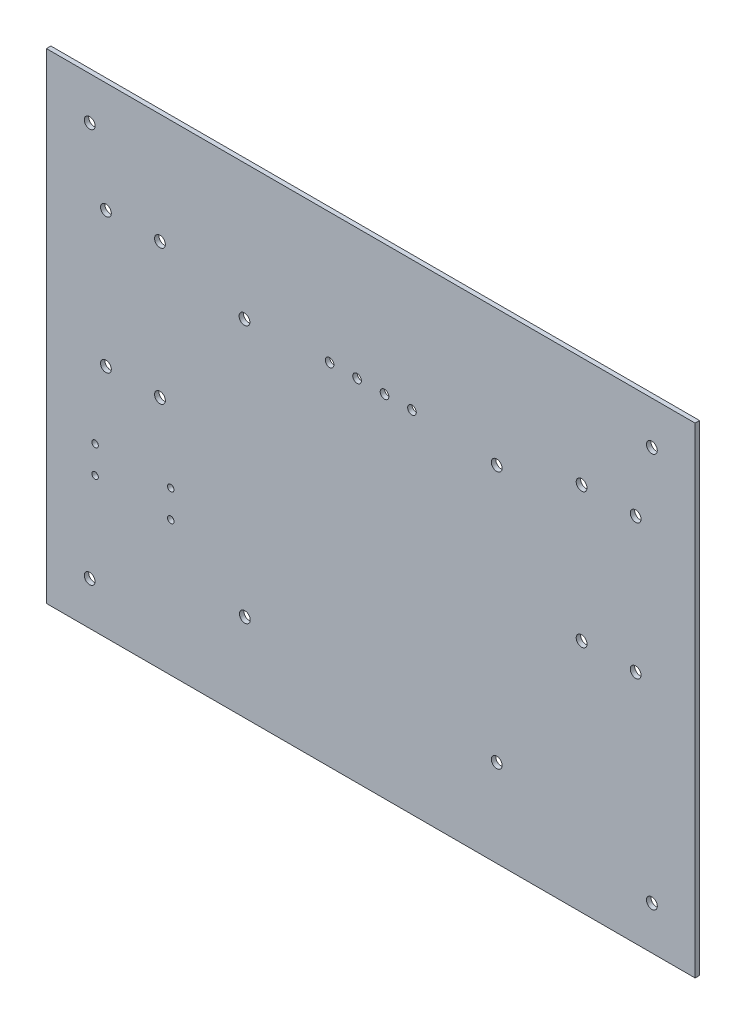
ISO-10303-21;
HEADER;
FILE_DESCRIPTION(('STEP AP214'),'2;1');
FILE_NAME('part.step','',(''),(''),'','','');
FILE_SCHEMA(('AUTOMOTIVE_DESIGN { 1 0 10303 214 1 1 1 1 }'));
ENDSEC;
DATA;
#1=APPLICATION_CONTEXT('core data for automotive mechanical design processes');
#2=APPLICATION_PROTOCOL_DEFINITION('international standard','automotive_design',2000,#1);
#3=PRODUCT_CONTEXT('',#1,'mechanical');
#4=PRODUCT('Part','Part','',(#3));
#5=PRODUCT_RELATED_PRODUCT_CATEGORY('part','',(#4));
#6=PRODUCT_DEFINITION_FORMATION('','',#4);
#7=PRODUCT_DEFINITION_CONTEXT('part definition',#1,'design');
#8=PRODUCT_DEFINITION('design','',#6,#7);
#9=PRODUCT_DEFINITION_SHAPE('','',#8);
#10=(LENGTH_UNIT() NAMED_UNIT(*) SI_UNIT(.MILLI.,.METRE.));
#11=(NAMED_UNIT(*) PLANE_ANGLE_UNIT() SI_UNIT($,.RADIAN.));
#12=(NAMED_UNIT(*) SI_UNIT($,.STERADIAN.) SOLID_ANGLE_UNIT());
#13=UNCERTAINTY_MEASURE_WITH_UNIT(LENGTH_MEASURE(1.E-05),#10,'distance_accuracy_value','');
#14=(GEOMETRIC_REPRESENTATION_CONTEXT(3) GLOBAL_UNCERTAINTY_ASSIGNED_CONTEXT((#13)) GLOBAL_UNIT_ASSIGNED_CONTEXT((#10,
#11,#12)) REPRESENTATION_CONTEXT('',''));
#15=CARTESIAN_POINT('',(0.,0.,0.));
#16=DIRECTION('',(0.,0.,1.));
#17=DIRECTION('',(1.,0.,0.));
#18=AXIS2_PLACEMENT_3D('',#15,#16,#17);
#19=CARTESIAN_POINT('',(0.,0.,0.));
#20=DIRECTION('',(0.,0.,-1.));
#21=DIRECTION('',(-1.,0.,0.));
#22=AXIS2_PLACEMENT_3D('',#19,#20,#21);
#23=PLANE('',#22);
#24=CARTESIAN_POINT('',(55.99999976,40.50000028,0.));
#25=DIRECTION('',(0.,0.,-1.));
#26=DIRECTION('',(-1.,0.,0.));
#27=AXIS2_PLACEMENT_3D('',#24,#25,#26);
#28=CIRCLE('',#27,0.499999);
#29=CARTESIAN_POINT('',(55.50000076,40.50000028,0.));
#30=VERTEX_POINT('',#29);
#31=EDGE_CURVE('E167',#30,#30,#28,.T.);
#32=ORIENTED_EDGE('',*,*,#31,.T.);
#33=EDGE_LOOP('',(#32));
#34=FACE_BOUND('',#33,.T.);
#35=CARTESIAN_POINT('',(54.50000022,34.25000008,0.));
#36=DIRECTION('',(0.,0.,-1.));
#37=DIRECTION('',(-1.,0.,0.));
#38=AXIS2_PLACEMENT_3D('',#35,#36,#37);
#39=CIRCLE('',#38,0.499999);
#40=CARTESIAN_POINT('',(54.00000122,34.25000008,0.));
#41=VERTEX_POINT('',#40);
#42=EDGE_CURVE('E170',#41,#41,#39,.T.);
#43=ORIENTED_EDGE('',*,*,#42,.T.);
#44=EDGE_LOOP('',(#43));
#45=FACE_BOUND('',#44,.T.);
#46=CARTESIAN_POINT('',(49.50000006,34.25000008,0.));
#47=DIRECTION('',(0.,0.,-1.));
#48=DIRECTION('',(-1.,0.,0.));
#49=AXIS2_PLACEMENT_3D('',#46,#47,#48);
#50=CIRCLE('',#49,0.499999);
#51=CARTESIAN_POINT('',(49.00000106,34.25000008,0.));
#52=VERTEX_POINT('',#51);
#53=EDGE_CURVE('E173',#52,#52,#50,.T.);
#54=ORIENTED_EDGE('',*,*,#53,.T.);
#55=EDGE_LOOP('',(#54));
#56=FACE_BOUND('',#55,.T.);
#57=CARTESIAN_POINT('',(28.73000096,32.40000124,0.));
#58=DIRECTION('',(0.,0.,-1.));
#59=DIRECTION('',(-1.,0.,0.));
#60=AXIS2_PLACEMENT_3D('',#57,#58,#59);
#61=CIRCLE('',#60,0.3999992);
#62=CARTESIAN_POINT('',(28.33000176,32.40000124,0.));
#63=VERTEX_POINT('',#62);
#64=EDGE_CURVE('E176',#63,#63,#61,.T.);
#65=ORIENTED_EDGE('',*,*,#64,.T.);
#66=EDGE_LOOP('',(#65));
#67=FACE_BOUND('',#66,.T.);
#68=CARTESIAN_POINT('',(26.19000096,32.40000124,0.));
#69=DIRECTION('',(0.,0.,-1.));
#70=DIRECTION('',(-1.,0.,0.));
#71=AXIS2_PLACEMENT_3D('',#68,#69,#70);
#72=CIRCLE('',#71,0.3999992);
#73=CARTESIAN_POINT('',(25.79000176,32.40000124,0.));
#74=VERTEX_POINT('',#73);
#75=EDGE_CURVE('E179',#74,#74,#72,.T.);
#76=ORIENTED_EDGE('',*,*,#75,.T.);
#77=EDGE_LOOP('',(#76));
#78=FACE_BOUND('',#77,.T.);
#79=CARTESIAN_POINT('',(31.27000096,32.40000124,0.));
#80=DIRECTION('',(0.,0.,-1.));
#81=DIRECTION('',(-1.,0.,0.));
#82=AXIS2_PLACEMENT_3D('',#79,#80,#81);
#83=CIRCLE('',#82,0.3999992);
#84=CARTESIAN_POINT('',(30.87000176,32.40000124,0.));
#85=VERTEX_POINT('',#84);
#86=EDGE_CURVE('E182',#85,#85,#83,.T.);
#87=ORIENTED_EDGE('',*,*,#86,.T.);
#88=EDGE_LOOP('',(#87));
#89=FACE_BOUND('',#88,.T.);
#90=CARTESIAN_POINT('',(54.50000022,21.74999968,0.));
#91=DIRECTION('',(0.,0.,-1.));
#92=DIRECTION('',(-1.,0.,0.));
#93=AXIS2_PLACEMENT_3D('',#90,#91,#92);
#94=CIRCLE('',#93,0.499999);
#95=CARTESIAN_POINT('',(54.00000122,21.74999968,0.));
#96=VERTEX_POINT('',#95);
#97=EDGE_CURVE('E185',#96,#96,#94,.T.);
#98=ORIENTED_EDGE('',*,*,#97,.T.);
#99=EDGE_LOOP('',(#98));
#100=FACE_BOUND('',#99,.T.);
#101=CARTESIAN_POINT('',(49.50000006,21.74999968,0.));
#102=DIRECTION('',(0.,0.,-1.));
#103=DIRECTION('',(-1.,0.,0.));
#104=AXIS2_PLACEMENT_3D('',#101,#102,#103);
#105=CIRCLE('',#104,0.499999);
#106=CARTESIAN_POINT('',(49.00000106,21.74999968,0.));
#107=VERTEX_POINT('',#106);
#108=EDGE_CURVE('E188',#107,#107,#105,.T.);
#109=ORIENTED_EDGE('',*,*,#108,.T.);
#110=EDGE_LOOP('',(#109));
#111=FACE_BOUND('',#110,.T.);
#112=CARTESIAN_POINT('',(55.99999976,3.99999962,0.));
#113=DIRECTION('',(0.,0.,-1.));
#114=DIRECTION('',(-1.,0.,0.));
#115=AXIS2_PLACEMENT_3D('',#112,#113,#114);
#116=CIRCLE('',#115,0.499999);
#117=CARTESIAN_POINT('',(55.50000076,3.99999962,0.));
#118=VERTEX_POINT('',#117);
#119=EDGE_CURVE('E191',#118,#118,#116,.T.);
#120=ORIENTED_EDGE('',*,*,#119,.T.);
#121=EDGE_LOOP('',(#120));
#122=FACE_BOUND('',#121,.T.);
#123=CARTESIAN_POINT('',(41.65000052,31.8999997,0.));
#124=DIRECTION('',(0.,0.,-1.));
#125=DIRECTION('',(-1.,0.,0.));
#126=AXIS2_PLACEMENT_3D('',#123,#124,#125);
#127=CIRCLE('',#126,0.499999);
#128=CARTESIAN_POINT('',(41.15000152,31.8999997,0.));
#129=VERTEX_POINT('',#128);
#130=EDGE_CURVE('E194',#129,#129,#127,.T.);
#131=ORIENTED_EDGE('',*,*,#130,.T.);
#132=EDGE_LOOP('',(#131));
#133=FACE_BOUND('',#132,.T.);
#134=CARTESIAN_POINT('',(33.81000096,32.40000124,0.));
#135=DIRECTION('',(0.,0.,-1.));
#136=DIRECTION('',(-1.,0.,0.));
#137=AXIS2_PLACEMENT_3D('',#134,#135,#136);
#138=CIRCLE('',#137,0.3999992);
#139=CARTESIAN_POINT('',(33.41000176,32.40000124,0.));
#140=VERTEX_POINT('',#139);
#141=EDGE_CURVE('E197',#140,#140,#138,.T.);
#142=ORIENTED_EDGE('',*,*,#141,.T.);
#143=EDGE_LOOP('',(#142));
#144=FACE_BOUND('',#143,.T.);
#145=CARTESIAN_POINT('',(41.65000052,8.10000158,0.));
#146=DIRECTION('',(0.,0.,-1.));
#147=DIRECTION('',(-1.,0.,0.));
#148=AXIS2_PLACEMENT_3D('',#145,#146,#147);
#149=CIRCLE('',#148,0.499999);
#150=CARTESIAN_POINT('',(41.15000152,8.10000158,0.));
#151=VERTEX_POINT('',#150);
#152=EDGE_CURVE('E200',#151,#151,#149,.T.);
#153=ORIENTED_EDGE('',*,*,#152,.T.);
#154=EDGE_LOOP('',(#153));
#155=FACE_BOUND('',#154,.T.);
#156=CARTESIAN_POINT('',(18.31600096,31.93800064,0.));
#157=DIRECTION('',(0.,0.,-1.));
#158=DIRECTION('',(-1.,0.,0.));
#159=AXIS2_PLACEMENT_3D('',#156,#157,#158);
#160=CIRCLE('',#159,0.499999);
#161=CARTESIAN_POINT('',(17.81600196,31.93800064,0.));
#162=VERTEX_POINT('',#161);
#163=EDGE_CURVE('E203',#162,#162,#160,.T.);
#164=ORIENTED_EDGE('',*,*,#163,.T.);
#165=EDGE_LOOP('',(#164));
#166=FACE_BOUND('',#165,.T.);
#167=CARTESIAN_POINT('',(10.49999932,34.25000008,0.));
#168=DIRECTION('',(0.,0.,-1.));
#169=DIRECTION('',(-1.,0.,0.));
#170=AXIS2_PLACEMENT_3D('',#167,#168,#169);
#171=CIRCLE('',#170,0.499999);
#172=CARTESIAN_POINT('',(10.00000032,34.25000008,0.));
#173=VERTEX_POINT('',#172);
#174=EDGE_CURVE('E206',#173,#173,#171,.T.);
#175=ORIENTED_EDGE('',*,*,#174,.T.);
#176=EDGE_LOOP('',(#175));
#177=FACE_BOUND('',#176,.T.);
#178=CARTESIAN_POINT('',(10.49999932,21.74999968,0.));
#179=DIRECTION('',(0.,0.,-1.));
#180=DIRECTION('',(-1.,0.,0.));
#181=AXIS2_PLACEMENT_3D('',#178,#179,#180);
#182=CIRCLE('',#181,0.499999);
#183=CARTESIAN_POINT('',(10.00000032,21.74999968,0.));
#184=VERTEX_POINT('',#183);
#185=EDGE_CURVE('E209',#184,#184,#182,.T.);
#186=ORIENTED_EDGE('',*,*,#185,.T.);
#187=EDGE_LOOP('',(#186));
#188=FACE_BOUND('',#187,.T.);
#189=CARTESIAN_POINT('',(5.49999916,34.25000008,0.));
#190=DIRECTION('',(0.,0.,-1.));
#191=DIRECTION('',(-1.,0.,0.));
#192=AXIS2_PLACEMENT_3D('',#189,#190,#191);
#193=CIRCLE('',#192,0.499999);
#194=CARTESIAN_POINT('',(5.00000016,34.25000008,0.));
#195=VERTEX_POINT('',#194);
#196=EDGE_CURVE('E212',#195,#195,#193,.T.);
#197=ORIENTED_EDGE('',*,*,#196,.T.);
#198=EDGE_LOOP('',(#197));
#199=FACE_BOUND('',#198,.T.);
#200=CARTESIAN_POINT('',(3.99999962,40.50000028,0.));
#201=DIRECTION('',(0.,0.,-1.));
#202=DIRECTION('',(-1.,0.,0.));
#203=AXIS2_PLACEMENT_3D('',#200,#201,#202);
#204=CIRCLE('',#203,0.499999);
#205=CARTESIAN_POINT('',(3.50000062,40.50000028,0.));
#206=VERTEX_POINT('',#205);
#207=EDGE_CURVE('E215',#206,#206,#204,.T.);
#208=ORIENTED_EDGE('',*,*,#207,.T.);
#209=EDGE_LOOP('',(#208));
#210=FACE_BOUND('',#209,.T.);
#211=CARTESIAN_POINT('',(5.49999916,21.74999968,0.));
#212=DIRECTION('',(0.,0.,-1.));
#213=DIRECTION('',(-1.,0.,0.));
#214=AXIS2_PLACEMENT_3D('',#211,#212,#213);
#215=CIRCLE('',#214,0.499999);
#216=CARTESIAN_POINT('',(5.00000016,21.74999968,0.));
#217=VERTEX_POINT('',#216);
#218=EDGE_CURVE('E218',#217,#217,#215,.T.);
#219=ORIENTED_EDGE('',*,*,#218,.T.);
#220=EDGE_LOOP('',(#219));
#221=FACE_BOUND('',#220,.T.);
#222=CARTESIAN_POINT('',(11.49999986,12.46000048,0.));
#223=DIRECTION('',(0.,0.,-1.));
#224=DIRECTION('',(-1.,0.,0.));
#225=AXIS2_PLACEMENT_3D('',#222,#223,#224);
#226=CIRCLE('',#225,0.2999994);
#227=CARTESIAN_POINT('',(11.20000046,12.46000048,0.));
#228=VERTEX_POINT('',#227);
#229=EDGE_CURVE('E221',#228,#228,#226,.T.);
#230=ORIENTED_EDGE('',*,*,#229,.T.);
#231=EDGE_LOOP('',(#230));
#232=FACE_BOUND('',#231,.T.);
#233=CARTESIAN_POINT('',(11.49999986,15.00000048,0.));
#234=DIRECTION('',(0.,0.,-1.));
#235=DIRECTION('',(-1.,0.,0.));
#236=AXIS2_PLACEMENT_3D('',#233,#234,#235);
#237=CIRCLE('',#236,0.2999994);
#238=CARTESIAN_POINT('',(11.20000046,15.00000048,0.));
#239=VERTEX_POINT('',#238);
#240=EDGE_CURVE('E224',#239,#239,#237,.T.);
#241=ORIENTED_EDGE('',*,*,#240,.T.);
#242=EDGE_LOOP('',(#241));
#243=FACE_BOUND('',#242,.T.);
#244=CARTESIAN_POINT('',(18.3500014,8.10000158,0.));
#245=DIRECTION('',(0.,0.,-1.));
#246=DIRECTION('',(-1.,0.,0.));
#247=AXIS2_PLACEMENT_3D('',#244,#245,#246);
#248=CIRCLE('',#247,0.499999);
#249=CARTESIAN_POINT('',(17.8500024,8.10000158,0.));
#250=VERTEX_POINT('',#249);
#251=EDGE_CURVE('E227',#250,#250,#248,.T.);
#252=ORIENTED_EDGE('',*,*,#251,.T.);
#253=EDGE_LOOP('',(#252));
#254=FACE_BOUND('',#253,.T.);
#255=CARTESIAN_POINT('',(4.50000116,12.5000004,0.));
#256=DIRECTION('',(0.,0.,-1.));
#257=DIRECTION('',(-1.,0.,0.));
#258=AXIS2_PLACEMENT_3D('',#255,#256,#257);
#259=CIRCLE('',#258,0.2999994);
#260=CARTESIAN_POINT('',(4.20000176,12.5000004,0.));
#261=VERTEX_POINT('',#260);
#262=EDGE_CURVE('E230',#261,#261,#259,.T.);
#263=ORIENTED_EDGE('',*,*,#262,.T.);
#264=EDGE_LOOP('',(#263));
#265=FACE_BOUND('',#264,.T.);
#266=CARTESIAN_POINT('',(4.50000116,15.0400004,0.));
#267=DIRECTION('',(0.,0.,-1.));
#268=DIRECTION('',(-1.,0.,0.));
#269=AXIS2_PLACEMENT_3D('',#266,#267,#268);
#270=CIRCLE('',#269,0.2999994);
#271=CARTESIAN_POINT('',(4.20000176,15.0400004,0.));
#272=VERTEX_POINT('',#271);
#273=EDGE_CURVE('E233',#272,#272,#270,.T.);
#274=ORIENTED_EDGE('',*,*,#273,.T.);
#275=EDGE_LOOP('',(#274));
#276=FACE_BOUND('',#275,.T.);
#277=CARTESIAN_POINT('',(3.99999962,3.99999962,0.));
#278=DIRECTION('',(0.,0.,-1.));
#279=DIRECTION('',(-1.,0.,0.));
#280=AXIS2_PLACEMENT_3D('',#277,#278,#279);
#281=CIRCLE('',#280,0.499999);
#282=CARTESIAN_POINT('',(3.50000062,3.99999962,0.));
#283=VERTEX_POINT('',#282);
#284=EDGE_CURVE('E94',#283,#283,#281,.T.);
#285=ORIENTED_EDGE('',*,*,#284,.T.);
#286=EDGE_LOOP('',(#285));
#287=FACE_BOUND('',#286,.T.);
#288=DIRECTION('',(0.,1.,0.));
#289=VECTOR('',#288,1.);
#290=CARTESIAN_POINT('',(60.,-1.999999949476E-05,0.));
#291=LINE('',#290,#289);
#292=CARTESIAN_POINT('',(60.,-1.99999994947575E-05,0.));
#293=VERTEX_POINT('',#292);
#294=CARTESIAN_POINT('',(60.,44.449989318848,0.));
#295=VERTEX_POINT('',#294);
#296=EDGE_CURVE('E59',#293,#295,#291,.T.);
#297=ORIENTED_EDGE('',*,*,#296,.T.);
#298=DIRECTION('',(-0.999999999999871,5.08626217300206E-07,0.));
#299=VECTOR('',#298,1.);
#300=CARTESIAN_POINT('',(60.,44.449989318848,0.));
#301=LINE('',#300,#299);
#302=CARTESIAN_POINT('',(-9.99999975248585E-06,44.4500198364261,0.));
#303=VERTEX_POINT('',#302);
#304=EDGE_CURVE('E56',#295,#303,#301,.T.);
#305=ORIENTED_EDGE('',*,*,#304,.T.);
#306=DIRECTION('',(2.24971772435194E-07,-0.999999999999975,0.));
#307=VECTOR('',#306,1.);
#308=CARTESIAN_POINT('',(0.,0.,0.));
#309=LINE('',#308,#307);
#310=CARTESIAN_POINT('',(0.,0.,0.));
#311=VERTEX_POINT('',#310);
#312=EDGE_CURVE('E20',#303,#311,#309,.T.);
#313=ORIENTED_EDGE('',*,*,#312,.T.);
#314=DIRECTION('',(-0.999999999999944,3.33333324912581E-07,0.));
#315=VECTOR('',#314,1.);
#316=CARTESIAN_POINT('',(0.,0.,0.));
#317=LINE('',#316,#315);
#318=EDGE_CURVE('E84',#311,#293,#317,.F.);
#319=ORIENTED_EDGE('',*,*,#318,.T.);
#320=EDGE_LOOP('',(#297,#305,#313,#319));
#321=FACE_BOUND('',#320,.T.);
#322=ADVANCED_FACE('F17',(#34,#45,#56,#67,#78,#89,#100,#111,#122,#133,#144,#155,#166,#177,#188,
#199,#210,#221,#232,#243,#254,#265,#276,#287,#321),#23,.F.);
#323=CARTESIAN_POINT('',(-9.999999747379E-06,44.450019836426,-0.41148));
#324=DIRECTION('',(0.999999999999975,2.24971772435194E-07,0.));
#325=DIRECTION('',(-2.24971772435194E-07,0.999999999999975,0.));
#326=AXIS2_PLACEMENT_3D('',#323,#324,#325);
#327=PLANE('',#326);
#328=DIRECTION('',(0.,0.,1.));
#329=VECTOR('',#328,1.);
#330=CARTESIAN_POINT('',(0.,0.,-0.41148));
#331=LINE('',#330,#329);
#332=CARTESIAN_POINT('',(0.,0.,-0.41148));
#333=VERTEX_POINT('',#332);
#334=EDGE_CURVE('E68',#333,#311,#331,.T.);
#335=ORIENTED_EDGE('',*,*,#334,.T.);
#336=ORIENTED_EDGE('',*,*,#312,.F.);
#337=DIRECTION('',(0.,0.,1.));
#338=VECTOR('',#337,1.);
#339=CARTESIAN_POINT('',(-9.99999975187515E-06,44.4500198364261,-0.41148));
#340=LINE('',#339,#338);
#341=CARTESIAN_POINT('',(-9.99999974850305E-06,44.4500198364261,-0.41148));
#342=VERTEX_POINT('',#341);
#343=EDGE_CURVE('E63',#303,#342,#340,.F.);
#344=ORIENTED_EDGE('',*,*,#343,.T.);
#345=DIRECTION('',(-2.24971772435194E-07,0.999999999999975,0.));
#346=VECTOR('',#345,1.);
#347=CARTESIAN_POINT('',(-9.999999747379E-06,44.450019836426,-0.41148));
#348=LINE('',#347,#346);
#349=EDGE_CURVE('E165',#333,#342,#348,.T.);
#350=ORIENTED_EDGE('',*,*,#349,.F.);
#351=EDGE_LOOP('',(#335,#336,#344,#350));
#352=FACE_BOUND('',#351,.T.);
#353=ADVANCED_FACE('F65',(#352),#327,.F.);
#354=CARTESIAN_POINT('',(60.,44.449989318848,-0.41148));
#355=DIRECTION('',(-5.08626217312134E-07,-0.999999999999871,0.));
#356=DIRECTION('',(0.999999999999871,-5.08626217312134E-07,0.));
#357=AXIS2_PLACEMENT_3D('',#354,#355,#356);
#358=PLANE('',#357);
#359=ORIENTED_EDGE('',*,*,#343,.F.);
#360=ORIENTED_EDGE('',*,*,#304,.F.);
#361=DIRECTION('',(0.,0.,1.));
#362=VECTOR('',#361,1.);
#363=CARTESIAN_POINT('',(60.,44.449989318848,-0.41148));
#364=LINE('',#363,#362);
#365=CARTESIAN_POINT('',(60.,44.449989318848,-0.41148));
#366=VERTEX_POINT('',#365);
#367=EDGE_CURVE('E75',#295,#366,#364,.F.);
#368=ORIENTED_EDGE('',*,*,#367,.T.);
#369=DIRECTION('',(0.999999999999871,-5.08626215335066E-07,0.));
#370=VECTOR('',#369,1.);
#371=CARTESIAN_POINT('',(0.,44.4500198364209,-0.41148));
#372=LINE('',#371,#370);
#373=EDGE_CURVE('E72',#342,#366,#372,.T.);
#374=ORIENTED_EDGE('',*,*,#373,.F.);
#375=EDGE_LOOP('',(#359,#360,#368,#374));
#376=FACE_BOUND('',#375,.T.);
#377=ADVANCED_FACE('F70',(#376),#358,.F.);
#378=CARTESIAN_POINT('',(60.,-1.999999949476E-05,-0.41148));
#379=DIRECTION('',(-1.,0.,0.));
#380=DIRECTION('',(0.,0.,1.));
#381=AXIS2_PLACEMENT_3D('',#378,#379,#380);
#382=PLANE('',#381);
#383=ORIENTED_EDGE('',*,*,#367,.F.);
#384=ORIENTED_EDGE('',*,*,#296,.F.);
#385=DIRECTION('',(0.,0.,1.));
#386=VECTOR('',#385,1.);
#387=CARTESIAN_POINT('',(60.,-1.9999999494756E-05,-0.41148));
#388=LINE('',#387,#386);
#389=CARTESIAN_POINT('',(60.,-1.9999999494759E-05,-0.41148));
#390=VERTEX_POINT('',#389);
#391=EDGE_CURVE('E35',#293,#390,#388,.F.);
#392=ORIENTED_EDGE('',*,*,#391,.T.);
#393=DIRECTION('',(0.,1.,0.));
#394=VECTOR('',#393,1.);
#395=CARTESIAN_POINT('',(60.,0.,-0.41148));
#396=LINE('',#395,#394);
#397=EDGE_CURVE('E78',#366,#390,#396,.F.);
#398=ORIENTED_EDGE('',*,*,#397,.F.);
#399=EDGE_LOOP('',(#383,#384,#392,#398));
#400=FACE_BOUND('',#399,.T.);
#401=ADVANCED_FACE('F254',(#400),#382,.F.);
#402=CARTESIAN_POINT('',(0.,0.,-0.41148));
#403=DIRECTION('',(3.33333324912581E-07,0.999999999999944,0.));
#404=DIRECTION('',(-0.999999999999944,3.33333324912581E-07,0.));
#405=AXIS2_PLACEMENT_3D('',#402,#403,#404);
#406=PLANE('',#405);
#407=ORIENTED_EDGE('',*,*,#391,.F.);
#408=ORIENTED_EDGE('',*,*,#318,.F.);
#409=ORIENTED_EDGE('',*,*,#334,.F.);
#410=DIRECTION('',(-0.999999999999944,3.33333324912648E-07,0.));
#411=VECTOR('',#410,1.);
#412=CARTESIAN_POINT('',(60.,-1.999999949476E-05,-0.41148));
#413=LINE('',#412,#411);
#414=EDGE_CURVE('E81',#390,#333,#413,.T.);
#415=ORIENTED_EDGE('',*,*,#414,.F.);
#416=EDGE_LOOP('',(#407,#408,#409,#415));
#417=FACE_BOUND('',#416,.T.);
#418=ADVANCED_FACE('F244',(#417),#406,.F.);
#419=CARTESIAN_POINT('',(3.99999962,3.99999962,-0.41148));
#420=DIRECTION('',(0.,0.,-1.));
#421=DIRECTION('',(-1.,0.,0.));
#422=AXIS2_PLACEMENT_3D('',#419,#420,#421);
#423=CYLINDRICAL_SURFACE('',#422,0.499999);
#424=ORIENTED_EDGE('',*,*,#284,.F.);
#425=EDGE_LOOP('',(#424));
#426=FACE_BOUND('',#425,.T.);
#427=CARTESIAN_POINT('',(3.99999962,3.99999962,-0.41148));
#428=DIRECTION('',(0.,0.,-1.));
#429=DIRECTION('',(-1.,0.,0.));
#430=AXIS2_PLACEMENT_3D('',#427,#428,#429);
#431=CIRCLE('',#430,0.499999);
#432=CARTESIAN_POINT('',(3.50000062,3.99999962,-0.41148));
#433=VERTEX_POINT('',#432);
#434=EDGE_CURVE('E87',#433,#433,#431,.F.);
#435=ORIENTED_EDGE('',*,*,#434,.F.);
#436=EDGE_LOOP('',(#435));
#437=FACE_BOUND('',#436,.T.);
#438=ADVANCED_FACE('F240',(#426,#437),#423,.F.);
#439=CARTESIAN_POINT('',(4.50000116,15.0400004,-0.41148));
#440=DIRECTION('',(0.,0.,-1.));
#441=DIRECTION('',(-1.,0.,0.));
#442=AXIS2_PLACEMENT_3D('',#439,#440,#441);
#443=CYLINDRICAL_SURFACE('',#442,0.2999994);
#444=ORIENTED_EDGE('',*,*,#273,.F.);
#445=EDGE_LOOP('',(#444));
#446=FACE_BOUND('',#445,.T.);
#447=CARTESIAN_POINT('',(4.50000116,15.0400004,-0.41148));
#448=DIRECTION('',(0.,0.,-1.));
#449=DIRECTION('',(-1.,0.,0.));
#450=AXIS2_PLACEMENT_3D('',#447,#448,#449);
#451=CIRCLE('',#450,0.2999994);
#452=CARTESIAN_POINT('',(4.20000176,15.0400004,-0.41148));
#453=VERTEX_POINT('',#452);
#454=EDGE_CURVE('E159',#453,#453,#451,.F.);
#455=ORIENTED_EDGE('',*,*,#454,.F.);
#456=EDGE_LOOP('',(#455));
#457=FACE_BOUND('',#456,.T.);
#458=ADVANCED_FACE('F243',(#446,#457),#443,.F.);
#459=CARTESIAN_POINT('',(4.50000116,12.5000004,-0.41148));
#460=DIRECTION('',(0.,0.,-1.));
#461=DIRECTION('',(-1.,0.,0.));
#462=AXIS2_PLACEMENT_3D('',#459,#460,#461);
#463=CYLINDRICAL_SURFACE('',#462,0.2999994);
#464=ORIENTED_EDGE('',*,*,#262,.F.);
#465=EDGE_LOOP('',(#464));
#466=FACE_BOUND('',#465,.T.);
#467=CARTESIAN_POINT('',(4.50000116,12.5000004,-0.41148));
#468=DIRECTION('',(0.,0.,-1.));
#469=DIRECTION('',(-1.,0.,0.));
#470=AXIS2_PLACEMENT_3D('',#467,#468,#469);
#471=CIRCLE('',#470,0.2999994);
#472=CARTESIAN_POINT('',(4.20000176,12.5000004,-0.41148));
#473=VERTEX_POINT('',#472);
#474=EDGE_CURVE('E156',#473,#473,#471,.F.);
#475=ORIENTED_EDGE('',*,*,#474,.F.);
#476=EDGE_LOOP('',(#475));
#477=FACE_BOUND('',#476,.T.);
#478=ADVANCED_FACE('F321',(#466,#477),#463,.F.);
#479=CARTESIAN_POINT('',(18.3500014,8.10000158,-0.41148));
#480=DIRECTION('',(0.,0.,-1.));
#481=DIRECTION('',(-1.,0.,0.));
#482=AXIS2_PLACEMENT_3D('',#479,#480,#481);
#483=CYLINDRICAL_SURFACE('',#482,0.499999);
#484=ORIENTED_EDGE('',*,*,#251,.F.);
#485=EDGE_LOOP('',(#484));
#486=FACE_BOUND('',#485,.T.);
#487=CARTESIAN_POINT('',(18.3500014,8.10000158,-0.41148));
#488=DIRECTION('',(0.,0.,-1.));
#489=DIRECTION('',(-1.,0.,0.));
#490=AXIS2_PLACEMENT_3D('',#487,#488,#489);
#491=CIRCLE('',#490,0.499999);
#492=CARTESIAN_POINT('',(17.8500024,8.10000158,-0.41148));
#493=VERTEX_POINT('',#492);
#494=EDGE_CURVE('E153',#493,#493,#491,.F.);
#495=ORIENTED_EDGE('',*,*,#494,.F.);
#496=EDGE_LOOP('',(#495));
#497=FACE_BOUND('',#496,.T.);
#498=ADVANCED_FACE('F327',(#486,#497),#483,.F.);
#499=CARTESIAN_POINT('',(11.49999986,15.00000048,-0.41148));
#500=DIRECTION('',(0.,0.,-1.));
#501=DIRECTION('',(-1.,0.,0.));
#502=AXIS2_PLACEMENT_3D('',#499,#500,#501);
#503=CYLINDRICAL_SURFACE('',#502,0.2999994);
#504=ORIENTED_EDGE('',*,*,#240,.F.);
#505=EDGE_LOOP('',(#504));
#506=FACE_BOUND('',#505,.T.);
#507=CARTESIAN_POINT('',(11.49999986,15.00000048,-0.41148));
#508=DIRECTION('',(0.,0.,-1.));
#509=DIRECTION('',(-1.,0.,0.));
#510=AXIS2_PLACEMENT_3D('',#507,#508,#509);
#511=CIRCLE('',#510,0.2999994);
#512=CARTESIAN_POINT('',(11.20000046,15.00000048,-0.41148));
#513=VERTEX_POINT('',#512);
#514=EDGE_CURVE('E150',#513,#513,#511,.F.);
#515=ORIENTED_EDGE('',*,*,#514,.F.);
#516=EDGE_LOOP('',(#515));
#517=FACE_BOUND('',#516,.T.);
#518=ADVANCED_FACE('F333',(#506,#517),#503,.F.);
#519=CARTESIAN_POINT('',(11.49999986,12.46000048,-0.41148));
#520=DIRECTION('',(0.,0.,-1.));
#521=DIRECTION('',(-1.,0.,0.));
#522=AXIS2_PLACEMENT_3D('',#519,#520,#521);
#523=CYLINDRICAL_SURFACE('',#522,0.2999994);
#524=ORIENTED_EDGE('',*,*,#229,.F.);
#525=EDGE_LOOP('',(#524));
#526=FACE_BOUND('',#525,.T.);
#527=CARTESIAN_POINT('',(11.49999986,12.46000048,-0.41148));
#528=DIRECTION('',(0.,0.,-1.));
#529=DIRECTION('',(-1.,0.,0.));
#530=AXIS2_PLACEMENT_3D('',#527,#528,#529);
#531=CIRCLE('',#530,0.2999994);
#532=CARTESIAN_POINT('',(11.20000046,12.46000048,-0.41148));
#533=VERTEX_POINT('',#532);
#534=EDGE_CURVE('E147',#533,#533,#531,.F.);
#535=ORIENTED_EDGE('',*,*,#534,.F.);
#536=EDGE_LOOP('',(#535));
#537=FACE_BOUND('',#536,.T.);
#538=ADVANCED_FACE('F337',(#526,#537),#523,.F.);
#539=CARTESIAN_POINT('',(5.49999916,21.74999968,-0.41148));
#540=DIRECTION('',(0.,0.,-1.));
#541=DIRECTION('',(-1.,0.,0.));
#542=AXIS2_PLACEMENT_3D('',#539,#540,#541);
#543=CYLINDRICAL_SURFACE('',#542,0.499999);
#544=ORIENTED_EDGE('',*,*,#218,.F.);
#545=EDGE_LOOP('',(#544));
#546=FACE_BOUND('',#545,.T.);
#547=CARTESIAN_POINT('',(5.49999916,21.74999968,-0.41148));
#548=DIRECTION('',(0.,0.,-1.));
#549=DIRECTION('',(-1.,0.,0.));
#550=AXIS2_PLACEMENT_3D('',#547,#548,#549);
#551=CIRCLE('',#550,0.499999);
#552=CARTESIAN_POINT('',(5.00000016,21.74999968,-0.41148));
#553=VERTEX_POINT('',#552);
#554=EDGE_CURVE('E144',#553,#553,#551,.F.);
#555=ORIENTED_EDGE('',*,*,#554,.F.);
#556=EDGE_LOOP('',(#555));
#557=FACE_BOUND('',#556,.T.);
#558=ADVANCED_FACE('F341',(#546,#557),#543,.F.);
#559=CARTESIAN_POINT('',(3.99999962,40.50000028,-0.41148));
#560=DIRECTION('',(0.,0.,-1.));
#561=DIRECTION('',(-1.,0.,0.));
#562=AXIS2_PLACEMENT_3D('',#559,#560,#561);
#563=CYLINDRICAL_SURFACE('',#562,0.499999);
#564=ORIENTED_EDGE('',*,*,#207,.F.);
#565=EDGE_LOOP('',(#564));
#566=FACE_BOUND('',#565,.T.);
#567=CARTESIAN_POINT('',(3.99999962,40.50000028,-0.41148));
#568=DIRECTION('',(0.,0.,-1.));
#569=DIRECTION('',(-1.,0.,0.));
#570=AXIS2_PLACEMENT_3D('',#567,#568,#569);
#571=CIRCLE('',#570,0.499999);
#572=CARTESIAN_POINT('',(3.50000062,40.50000028,-0.41148));
#573=VERTEX_POINT('',#572);
#574=EDGE_CURVE('E141',#573,#573,#571,.F.);
#575=ORIENTED_EDGE('',*,*,#574,.F.);
#576=EDGE_LOOP('',(#575));
#577=FACE_BOUND('',#576,.T.);
#578=ADVANCED_FACE('F345',(#566,#577),#563,.F.);
#579=CARTESIAN_POINT('',(5.49999916,34.25000008,-0.41148));
#580=DIRECTION('',(0.,0.,-1.));
#581=DIRECTION('',(-1.,0.,0.));
#582=AXIS2_PLACEMENT_3D('',#579,#580,#581);
#583=CYLINDRICAL_SURFACE('',#582,0.499999);
#584=ORIENTED_EDGE('',*,*,#196,.F.);
#585=EDGE_LOOP('',(#584));
#586=FACE_BOUND('',#585,.T.);
#587=CARTESIAN_POINT('',(5.49999916,34.25000008,-0.41148));
#588=DIRECTION('',(0.,0.,-1.));
#589=DIRECTION('',(-1.,0.,0.));
#590=AXIS2_PLACEMENT_3D('',#587,#588,#589);
#591=CIRCLE('',#590,0.499999);
#592=CARTESIAN_POINT('',(5.00000016,34.25000008,-0.41148));
#593=VERTEX_POINT('',#592);
#594=EDGE_CURVE('E138',#593,#593,#591,.F.);
#595=ORIENTED_EDGE('',*,*,#594,.F.);
#596=EDGE_LOOP('',(#595));
#597=FACE_BOUND('',#596,.T.);
#598=ADVANCED_FACE('F349',(#586,#597),#583,.F.);
#599=CARTESIAN_POINT('',(10.49999932,21.74999968,-0.41148));
#600=DIRECTION('',(0.,0.,-1.));
#601=DIRECTION('',(-1.,0.,0.));
#602=AXIS2_PLACEMENT_3D('',#599,#600,#601);
#603=CYLINDRICAL_SURFACE('',#602,0.499999);
#604=ORIENTED_EDGE('',*,*,#185,.F.);
#605=EDGE_LOOP('',(#604));
#606=FACE_BOUND('',#605,.T.);
#607=CARTESIAN_POINT('',(10.49999932,21.74999968,-0.41148));
#608=DIRECTION('',(0.,0.,-1.));
#609=DIRECTION('',(-1.,0.,0.));
#610=AXIS2_PLACEMENT_3D('',#607,#608,#609);
#611=CIRCLE('',#610,0.499999);
#612=CARTESIAN_POINT('',(10.00000032,21.74999968,-0.41148));
#613=VERTEX_POINT('',#612);
#614=EDGE_CURVE('E135',#613,#613,#611,.F.);
#615=ORIENTED_EDGE('',*,*,#614,.F.);
#616=EDGE_LOOP('',(#615));
#617=FACE_BOUND('',#616,.T.);
#618=ADVANCED_FACE('F353',(#606,#617),#603,.F.);
#619=CARTESIAN_POINT('',(10.49999932,34.25000008,-0.41148));
#620=DIRECTION('',(0.,0.,-1.));
#621=DIRECTION('',(-1.,0.,0.));
#622=AXIS2_PLACEMENT_3D('',#619,#620,#621);
#623=CYLINDRICAL_SURFACE('',#622,0.499999);
#624=ORIENTED_EDGE('',*,*,#174,.F.);
#625=EDGE_LOOP('',(#624));
#626=FACE_BOUND('',#625,.T.);
#627=CARTESIAN_POINT('',(10.49999932,34.25000008,-0.41148));
#628=DIRECTION('',(0.,0.,-1.));
#629=DIRECTION('',(-1.,0.,0.));
#630=AXIS2_PLACEMENT_3D('',#627,#628,#629);
#631=CIRCLE('',#630,0.499999);
#632=CARTESIAN_POINT('',(10.00000032,34.25000008,-0.41148));
#633=VERTEX_POINT('',#632);
#634=EDGE_CURVE('E132',#633,#633,#631,.F.);
#635=ORIENTED_EDGE('',*,*,#634,.F.);
#636=EDGE_LOOP('',(#635));
#637=FACE_BOUND('',#636,.T.);
#638=ADVANCED_FACE('F357',(#626,#637),#623,.F.);
#639=CARTESIAN_POINT('',(18.31600096,31.93800064,-0.41148));
#640=DIRECTION('',(0.,0.,-1.));
#641=DIRECTION('',(-1.,0.,0.));
#642=AXIS2_PLACEMENT_3D('',#639,#640,#641);
#643=CYLINDRICAL_SURFACE('',#642,0.499999);
#644=ORIENTED_EDGE('',*,*,#163,.F.);
#645=EDGE_LOOP('',(#644));
#646=FACE_BOUND('',#645,.T.);
#647=CARTESIAN_POINT('',(18.31600096,31.93800064,-0.41148));
#648=DIRECTION('',(0.,0.,-1.));
#649=DIRECTION('',(-1.,0.,0.));
#650=AXIS2_PLACEMENT_3D('',#647,#648,#649);
#651=CIRCLE('',#650,0.499999);
#652=CARTESIAN_POINT('',(17.81600196,31.93800064,-0.41148));
#653=VERTEX_POINT('',#652);
#654=EDGE_CURVE('E129',#653,#653,#651,.F.);
#655=ORIENTED_EDGE('',*,*,#654,.F.);
#656=EDGE_LOOP('',(#655));
#657=FACE_BOUND('',#656,.T.);
#658=ADVANCED_FACE('F361',(#646,#657),#643,.F.);
#659=CARTESIAN_POINT('',(41.65000052,8.10000158,-0.41148));
#660=DIRECTION('',(0.,0.,-1.));
#661=DIRECTION('',(-1.,0.,0.));
#662=AXIS2_PLACEMENT_3D('',#659,#660,#661);
#663=CYLINDRICAL_SURFACE('',#662,0.499999);
#664=ORIENTED_EDGE('',*,*,#152,.F.);
#665=EDGE_LOOP('',(#664));
#666=FACE_BOUND('',#665,.T.);
#667=CARTESIAN_POINT('',(41.65000052,8.10000158,-0.41148));
#668=DIRECTION('',(0.,0.,-1.));
#669=DIRECTION('',(-1.,0.,0.));
#670=AXIS2_PLACEMENT_3D('',#667,#668,#669);
#671=CIRCLE('',#670,0.499999);
#672=CARTESIAN_POINT('',(41.15000152,8.10000158,-0.41148));
#673=VERTEX_POINT('',#672);
#674=EDGE_CURVE('E126',#673,#673,#671,.F.);
#675=ORIENTED_EDGE('',*,*,#674,.F.);
#676=EDGE_LOOP('',(#675));
#677=FACE_BOUND('',#676,.T.);
#678=ADVANCED_FACE('F365',(#666,#677),#663,.F.);
#679=CARTESIAN_POINT('',(33.81000096,32.40000124,-0.41148));
#680=DIRECTION('',(0.,0.,-1.));
#681=DIRECTION('',(-1.,0.,0.));
#682=AXIS2_PLACEMENT_3D('',#679,#680,#681);
#683=CYLINDRICAL_SURFACE('',#682,0.3999992);
#684=ORIENTED_EDGE('',*,*,#141,.F.);
#685=EDGE_LOOP('',(#684));
#686=FACE_BOUND('',#685,.T.);
#687=CARTESIAN_POINT('',(33.81000096,32.40000124,-0.41148));
#688=DIRECTION('',(0.,0.,-1.));
#689=DIRECTION('',(-1.,0.,0.));
#690=AXIS2_PLACEMENT_3D('',#687,#688,#689);
#691=CIRCLE('',#690,0.3999992);
#692=CARTESIAN_POINT('',(33.41000176,32.40000124,-0.41148));
#693=VERTEX_POINT('',#692);
#694=EDGE_CURVE('E123',#693,#693,#691,.F.);
#695=ORIENTED_EDGE('',*,*,#694,.F.);
#696=EDGE_LOOP('',(#695));
#697=FACE_BOUND('',#696,.T.);
#698=ADVANCED_FACE('F369',(#686,#697),#683,.F.);
#699=CARTESIAN_POINT('',(41.65000052,31.8999997,-0.41148));
#700=DIRECTION('',(0.,0.,-1.));
#701=DIRECTION('',(-1.,0.,0.));
#702=AXIS2_PLACEMENT_3D('',#699,#700,#701);
#703=CYLINDRICAL_SURFACE('',#702,0.499999);
#704=ORIENTED_EDGE('',*,*,#130,.F.);
#705=EDGE_LOOP('',(#704));
#706=FACE_BOUND('',#705,.T.);
#707=CARTESIAN_POINT('',(41.65000052,31.8999997,-0.41148));
#708=DIRECTION('',(0.,0.,-1.));
#709=DIRECTION('',(-1.,0.,0.));
#710=AXIS2_PLACEMENT_3D('',#707,#708,#709);
#711=CIRCLE('',#710,0.499999);
#712=CARTESIAN_POINT('',(41.15000152,31.8999997,-0.41148));
#713=VERTEX_POINT('',#712);
#714=EDGE_CURVE('E120',#713,#713,#711,.F.);
#715=ORIENTED_EDGE('',*,*,#714,.F.);
#716=EDGE_LOOP('',(#715));
#717=FACE_BOUND('',#716,.T.);
#718=ADVANCED_FACE('F373',(#706,#717),#703,.F.);
#719=CARTESIAN_POINT('',(55.99999976,3.99999962,-0.41148));
#720=DIRECTION('',(0.,0.,-1.));
#721=DIRECTION('',(-1.,0.,0.));
#722=AXIS2_PLACEMENT_3D('',#719,#720,#721);
#723=CYLINDRICAL_SURFACE('',#722,0.499999);
#724=ORIENTED_EDGE('',*,*,#119,.F.);
#725=EDGE_LOOP('',(#724));
#726=FACE_BOUND('',#725,.T.);
#727=CARTESIAN_POINT('',(55.99999976,3.99999962,-0.41148));
#728=DIRECTION('',(0.,0.,-1.));
#729=DIRECTION('',(-1.,0.,0.));
#730=AXIS2_PLACEMENT_3D('',#727,#728,#729);
#731=CIRCLE('',#730,0.499999);
#732=CARTESIAN_POINT('',(55.50000076,3.99999962,-0.41148));
#733=VERTEX_POINT('',#732);
#734=EDGE_CURVE('E117',#733,#733,#731,.F.);
#735=ORIENTED_EDGE('',*,*,#734,.F.);
#736=EDGE_LOOP('',(#735));
#737=FACE_BOUND('',#736,.T.);
#738=ADVANCED_FACE('F377',(#726,#737),#723,.F.);
#739=CARTESIAN_POINT('',(49.50000006,21.74999968,-0.41148));
#740=DIRECTION('',(0.,0.,-1.));
#741=DIRECTION('',(-1.,0.,0.));
#742=AXIS2_PLACEMENT_3D('',#739,#740,#741);
#743=CYLINDRICAL_SURFACE('',#742,0.499999);
#744=ORIENTED_EDGE('',*,*,#108,.F.);
#745=EDGE_LOOP('',(#744));
#746=FACE_BOUND('',#745,.T.);
#747=CARTESIAN_POINT('',(49.50000006,21.74999968,-0.41148));
#748=DIRECTION('',(0.,0.,-1.));
#749=DIRECTION('',(-1.,0.,0.));
#750=AXIS2_PLACEMENT_3D('',#747,#748,#749);
#751=CIRCLE('',#750,0.499999);
#752=CARTESIAN_POINT('',(49.00000106,21.74999968,-0.41148));
#753=VERTEX_POINT('',#752);
#754=EDGE_CURVE('E114',#753,#753,#751,.F.);
#755=ORIENTED_EDGE('',*,*,#754,.F.);
#756=EDGE_LOOP('',(#755));
#757=FACE_BOUND('',#756,.T.);
#758=ADVANCED_FACE('F381',(#746,#757),#743,.F.);
#759=CARTESIAN_POINT('',(54.50000022,21.74999968,-0.41148));
#760=DIRECTION('',(0.,0.,-1.));
#761=DIRECTION('',(-1.,0.,0.));
#762=AXIS2_PLACEMENT_3D('',#759,#760,#761);
#763=CYLINDRICAL_SURFACE('',#762,0.499999);
#764=ORIENTED_EDGE('',*,*,#97,.F.);
#765=EDGE_LOOP('',(#764));
#766=FACE_BOUND('',#765,.T.);
#767=CARTESIAN_POINT('',(54.50000022,21.74999968,-0.41148));
#768=DIRECTION('',(0.,0.,-1.));
#769=DIRECTION('',(-1.,0.,0.));
#770=AXIS2_PLACEMENT_3D('',#767,#768,#769);
#771=CIRCLE('',#770,0.499999);
#772=CARTESIAN_POINT('',(54.00000122,21.74999968,-0.41148));
#773=VERTEX_POINT('',#772);
#774=EDGE_CURVE('E111',#773,#773,#771,.F.);
#775=ORIENTED_EDGE('',*,*,#774,.F.);
#776=EDGE_LOOP('',(#775));
#777=FACE_BOUND('',#776,.T.);
#778=ADVANCED_FACE('F385',(#766,#777),#763,.F.);
#779=CARTESIAN_POINT('',(31.27000096,32.40000124,-0.41148));
#780=DIRECTION('',(0.,0.,-1.));
#781=DIRECTION('',(-1.,0.,0.));
#782=AXIS2_PLACEMENT_3D('',#779,#780,#781);
#783=CYLINDRICAL_SURFACE('',#782,0.3999992);
#784=ORIENTED_EDGE('',*,*,#86,.F.);
#785=EDGE_LOOP('',(#784));
#786=FACE_BOUND('',#785,.T.);
#787=CARTESIAN_POINT('',(31.27000096,32.40000124,-0.41148));
#788=DIRECTION('',(0.,0.,-1.));
#789=DIRECTION('',(-1.,0.,0.));
#790=AXIS2_PLACEMENT_3D('',#787,#788,#789);
#791=CIRCLE('',#790,0.3999992);
#792=CARTESIAN_POINT('',(30.87000176,32.40000124,-0.41148));
#793=VERTEX_POINT('',#792);
#794=EDGE_CURVE('E108',#793,#793,#791,.F.);
#795=ORIENTED_EDGE('',*,*,#794,.F.);
#796=EDGE_LOOP('',(#795));
#797=FACE_BOUND('',#796,.T.);
#798=ADVANCED_FACE('F389',(#786,#797),#783,.F.);
#799=CARTESIAN_POINT('',(26.19000096,32.40000124,-0.41148));
#800=DIRECTION('',(0.,0.,-1.));
#801=DIRECTION('',(-1.,0.,0.));
#802=AXIS2_PLACEMENT_3D('',#799,#800,#801);
#803=CYLINDRICAL_SURFACE('',#802,0.3999992);
#804=ORIENTED_EDGE('',*,*,#75,.F.);
#805=EDGE_LOOP('',(#804));
#806=FACE_BOUND('',#805,.T.);
#807=CARTESIAN_POINT('',(26.19000096,32.40000124,-0.41148));
#808=DIRECTION('',(0.,0.,-1.));
#809=DIRECTION('',(-1.,0.,0.));
#810=AXIS2_PLACEMENT_3D('',#807,#808,#809);
#811=CIRCLE('',#810,0.3999992);
#812=CARTESIAN_POINT('',(25.79000176,32.40000124,-0.41148));
#813=VERTEX_POINT('',#812);
#814=EDGE_CURVE('E105',#813,#813,#811,.F.);
#815=ORIENTED_EDGE('',*,*,#814,.F.);
#816=EDGE_LOOP('',(#815));
#817=FACE_BOUND('',#816,.T.);
#818=ADVANCED_FACE('F393',(#806,#817),#803,.F.);
#819=CARTESIAN_POINT('',(28.73000096,32.40000124,-0.41148));
#820=DIRECTION('',(0.,0.,-1.));
#821=DIRECTION('',(-1.,0.,0.));
#822=AXIS2_PLACEMENT_3D('',#819,#820,#821);
#823=CYLINDRICAL_SURFACE('',#822,0.3999992);
#824=ORIENTED_EDGE('',*,*,#64,.F.);
#825=EDGE_LOOP('',(#824));
#826=FACE_BOUND('',#825,.T.);
#827=CARTESIAN_POINT('',(28.73000096,32.40000124,-0.41148));
#828=DIRECTION('',(0.,0.,-1.));
#829=DIRECTION('',(-1.,0.,0.));
#830=AXIS2_PLACEMENT_3D('',#827,#828,#829);
#831=CIRCLE('',#830,0.3999992);
#832=CARTESIAN_POINT('',(28.33000176,32.40000124,-0.41148));
#833=VERTEX_POINT('',#832);
#834=EDGE_CURVE('E102',#833,#833,#831,.F.);
#835=ORIENTED_EDGE('',*,*,#834,.F.);
#836=EDGE_LOOP('',(#835));
#837=FACE_BOUND('',#836,.T.);
#838=ADVANCED_FACE('F397',(#826,#837),#823,.F.);
#839=CARTESIAN_POINT('',(49.50000006,34.25000008,-0.41148));
#840=DIRECTION('',(0.,0.,-1.));
#841=DIRECTION('',(-1.,0.,0.));
#842=AXIS2_PLACEMENT_3D('',#839,#840,#841);
#843=CYLINDRICAL_SURFACE('',#842,0.499999);
#844=ORIENTED_EDGE('',*,*,#53,.F.);
#845=EDGE_LOOP('',(#844));
#846=FACE_BOUND('',#845,.T.);
#847=CARTESIAN_POINT('',(49.50000006,34.25000008,-0.41148));
#848=DIRECTION('',(0.,0.,-1.));
#849=DIRECTION('',(-1.,0.,0.));
#850=AXIS2_PLACEMENT_3D('',#847,#848,#849);
#851=CIRCLE('',#850,0.499999);
#852=CARTESIAN_POINT('',(49.00000106,34.25000008,-0.41148));
#853=VERTEX_POINT('',#852);
#854=EDGE_CURVE('E99',#853,#853,#851,.F.);
#855=ORIENTED_EDGE('',*,*,#854,.F.);
#856=EDGE_LOOP('',(#855));
#857=FACE_BOUND('',#856,.T.);
#858=ADVANCED_FACE('F401',(#846,#857),#843,.F.);
#859=CARTESIAN_POINT('',(54.50000022,34.25000008,-0.41148));
#860=DIRECTION('',(0.,0.,-1.));
#861=DIRECTION('',(-1.,0.,0.));
#862=AXIS2_PLACEMENT_3D('',#859,#860,#861);
#863=CYLINDRICAL_SURFACE('',#862,0.499999);
#864=ORIENTED_EDGE('',*,*,#42,.F.);
#865=EDGE_LOOP('',(#864));
#866=FACE_BOUND('',#865,.T.);
#867=CARTESIAN_POINT('',(54.50000022,34.25000008,-0.41148));
#868=DIRECTION('',(0.,0.,-1.));
#869=DIRECTION('',(-1.,0.,0.));
#870=AXIS2_PLACEMENT_3D('',#867,#868,#869);
#871=CIRCLE('',#870,0.499999);
#872=CARTESIAN_POINT('',(54.00000122,34.25000008,-0.41148));
#873=VERTEX_POINT('',#872);
#874=EDGE_CURVE('E26',#873,#873,#871,.F.);
#875=ORIENTED_EDGE('',*,*,#874,.F.);
#876=EDGE_LOOP('',(#875));
#877=FACE_BOUND('',#876,.T.);
#878=ADVANCED_FACE('F405',(#866,#877),#863,.F.);
#879=CARTESIAN_POINT('',(55.99999976,40.50000028,-0.41148));
#880=DIRECTION('',(0.,0.,-1.));
#881=DIRECTION('',(-1.,0.,0.));
#882=AXIS2_PLACEMENT_3D('',#879,#880,#881);
#883=CYLINDRICAL_SURFACE('',#882,0.499999);
#884=ORIENTED_EDGE('',*,*,#31,.F.);
#885=EDGE_LOOP('',(#884));
#886=FACE_BOUND('',#885,.T.);
#887=CARTESIAN_POINT('',(55.99999976,40.50000028,-0.41148));
#888=DIRECTION('',(0.,0.,-1.));
#889=DIRECTION('',(-1.,0.,0.));
#890=AXIS2_PLACEMENT_3D('',#887,#888,#889);
#891=CIRCLE('',#890,0.499999);
#892=CARTESIAN_POINT('',(55.50000076,40.50000028,-0.41148));
#893=VERTEX_POINT('',#892);
#894=EDGE_CURVE('E11',#893,#893,#891,.F.);
#895=ORIENTED_EDGE('',*,*,#894,.F.);
#896=EDGE_LOOP('',(#895));
#897=FACE_BOUND('',#896,.T.);
#898=ADVANCED_FACE('F251',(#886,#897),#883,.F.);
#899=CARTESIAN_POINT('',(0.,0.,-0.41148));
#900=DIRECTION('',(0.,0.,-1.));
#901=DIRECTION('',(-1.,0.,0.));
#902=AXIS2_PLACEMENT_3D('',#899,#900,#901);
#903=PLANE('',#902);
#904=ORIENTED_EDGE('',*,*,#894,.T.);
#905=EDGE_LOOP('',(#904));
#906=FACE_BOUND('',#905,.T.);
#907=ORIENTED_EDGE('',*,*,#874,.T.);
#908=EDGE_LOOP('',(#907));
#909=FACE_BOUND('',#908,.T.);
#910=ORIENTED_EDGE('',*,*,#854,.T.);
#911=EDGE_LOOP('',(#910));
#912=FACE_BOUND('',#911,.T.);
#913=ORIENTED_EDGE('',*,*,#834,.T.);
#914=EDGE_LOOP('',(#913));
#915=FACE_BOUND('',#914,.T.);
#916=ORIENTED_EDGE('',*,*,#814,.T.);
#917=EDGE_LOOP('',(#916));
#918=FACE_BOUND('',#917,.T.);
#919=ORIENTED_EDGE('',*,*,#794,.T.);
#920=EDGE_LOOP('',(#919));
#921=FACE_BOUND('',#920,.T.);
#922=ORIENTED_EDGE('',*,*,#774,.T.);
#923=EDGE_LOOP('',(#922));
#924=FACE_BOUND('',#923,.T.);
#925=ORIENTED_EDGE('',*,*,#754,.T.);
#926=EDGE_LOOP('',(#925));
#927=FACE_BOUND('',#926,.T.);
#928=ORIENTED_EDGE('',*,*,#734,.T.);
#929=EDGE_LOOP('',(#928));
#930=FACE_BOUND('',#929,.T.);
#931=ORIENTED_EDGE('',*,*,#714,.T.);
#932=EDGE_LOOP('',(#931));
#933=FACE_BOUND('',#932,.T.);
#934=ORIENTED_EDGE('',*,*,#694,.T.);
#935=EDGE_LOOP('',(#934));
#936=FACE_BOUND('',#935,.T.);
#937=ORIENTED_EDGE('',*,*,#674,.T.);
#938=EDGE_LOOP('',(#937));
#939=FACE_BOUND('',#938,.T.);
#940=ORIENTED_EDGE('',*,*,#654,.T.);
#941=EDGE_LOOP('',(#940));
#942=FACE_BOUND('',#941,.T.);
#943=ORIENTED_EDGE('',*,*,#634,.T.);
#944=EDGE_LOOP('',(#943));
#945=FACE_BOUND('',#944,.T.);
#946=ORIENTED_EDGE('',*,*,#614,.T.);
#947=EDGE_LOOP('',(#946));
#948=FACE_BOUND('',#947,.T.);
#949=ORIENTED_EDGE('',*,*,#594,.T.);
#950=EDGE_LOOP('',(#949));
#951=FACE_BOUND('',#950,.T.);
#952=ORIENTED_EDGE('',*,*,#574,.T.);
#953=EDGE_LOOP('',(#952));
#954=FACE_BOUND('',#953,.T.);
#955=ORIENTED_EDGE('',*,*,#554,.T.);
#956=EDGE_LOOP('',(#955));
#957=FACE_BOUND('',#956,.T.);
#958=ORIENTED_EDGE('',*,*,#534,.T.);
#959=EDGE_LOOP('',(#958));
#960=FACE_BOUND('',#959,.T.);
#961=ORIENTED_EDGE('',*,*,#514,.T.);
#962=EDGE_LOOP('',(#961));
#963=FACE_BOUND('',#962,.T.);
#964=ORIENTED_EDGE('',*,*,#494,.T.);
#965=EDGE_LOOP('',(#964));
#966=FACE_BOUND('',#965,.T.);
#967=ORIENTED_EDGE('',*,*,#474,.T.);
#968=EDGE_LOOP('',(#967));
#969=FACE_BOUND('',#968,.T.);
#970=ORIENTED_EDGE('',*,*,#454,.T.);
#971=EDGE_LOOP('',(#970));
#972=FACE_BOUND('',#971,.T.);
#973=ORIENTED_EDGE('',*,*,#434,.T.);
#974=EDGE_LOOP('',(#973));
#975=FACE_BOUND('',#974,.T.);
#976=ORIENTED_EDGE('',*,*,#397,.T.);
#977=ORIENTED_EDGE('',*,*,#414,.T.);
#978=ORIENTED_EDGE('',*,*,#349,.T.);
#979=ORIENTED_EDGE('',*,*,#373,.T.);
#980=EDGE_LOOP('',(#976,#977,#978,#979));
#981=FACE_BOUND('',#980,.T.);
#982=ADVANCED_FACE('F248',(#906,#909,#912,#915,#918,#921,#924,#927,#930,#933,#936,#939,#942,
#945,#948,#951,#954,#957,#960,#963,#966,#969,#972,#975,#981),#903,.T.);
#983=CLOSED_SHELL('',(#322,#353,#377,#401,#418,#438,#458,#478,#498,#518,#538,#558,#578,#598,
#618,#638,#658,#678,#698,#718,#738,#758,#778,#798,#818,#838,#858,#878,#898,#982));
#984=MANIFOLD_SOLID_BREP('B1',#983);
#985=ADVANCED_BREP_SHAPE_REPRESENTATION('',(#18,#984),#14);
#986=SHAPE_DEFINITION_REPRESENTATION(#9,#985);
ENDSEC;
END-ISO-10303-21;
